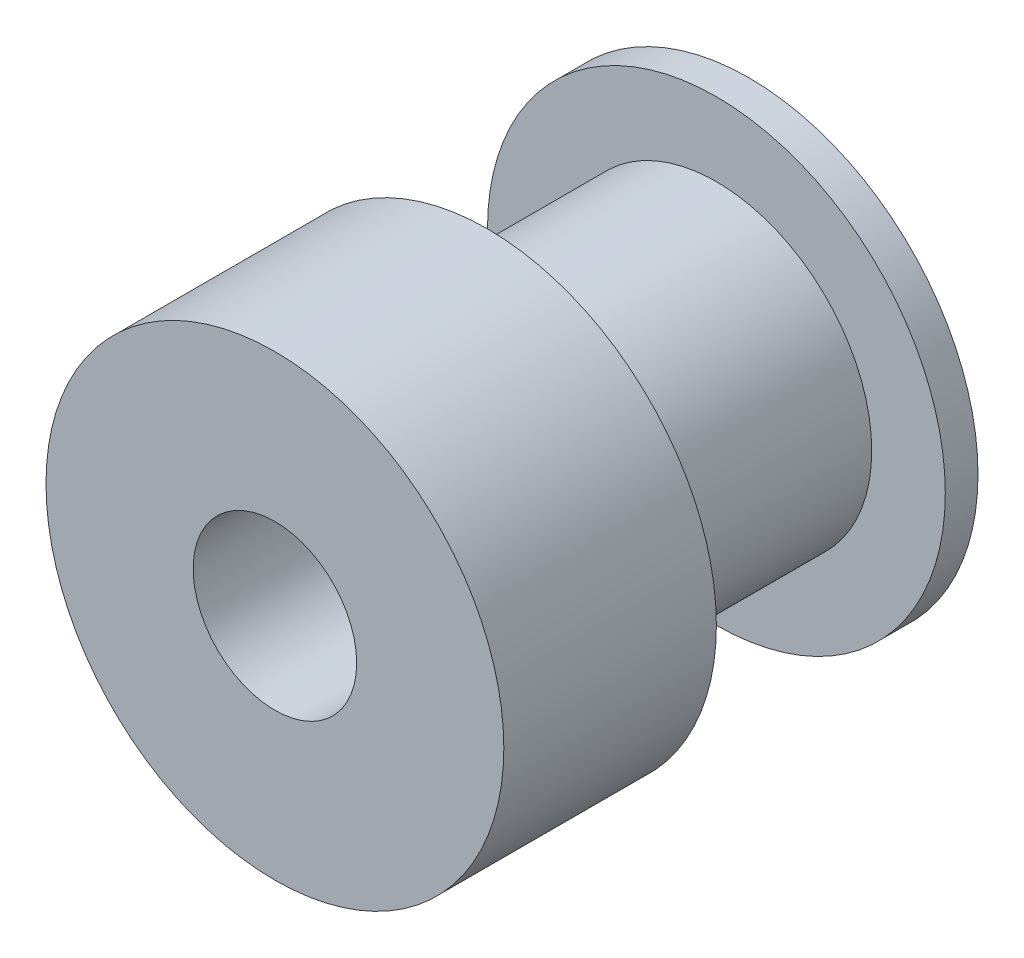
ISO-10303-21;
HEADER;
FILE_DESCRIPTION(('STEP AP214'),'2;1');
FILE_NAME('part.step','',(''),(''),'','','');
FILE_SCHEMA(('AUTOMOTIVE_DESIGN { 1 0 10303 214 1 1 1 1 }'));
ENDSEC;
DATA;
#1=APPLICATION_CONTEXT('core data for automotive mechanical design processes');
#2=APPLICATION_PROTOCOL_DEFINITION('international standard','automotive_design',2000,#1);
#3=PRODUCT_CONTEXT('',#1,'mechanical');
#4=PRODUCT('Part','Part','',(#3));
#5=PRODUCT_RELATED_PRODUCT_CATEGORY('part','',(#4));
#6=PRODUCT_DEFINITION_FORMATION('','',#4);
#7=PRODUCT_DEFINITION_CONTEXT('part definition',#1,'design');
#8=PRODUCT_DEFINITION('design','',#6,#7);
#9=PRODUCT_DEFINITION_SHAPE('','',#8);
#10=(LENGTH_UNIT() NAMED_UNIT(*) SI_UNIT(.MILLI.,.METRE.));
#11=(NAMED_UNIT(*) PLANE_ANGLE_UNIT() SI_UNIT($,.RADIAN.));
#12=(NAMED_UNIT(*) SI_UNIT($,.STERADIAN.) SOLID_ANGLE_UNIT());
#13=UNCERTAINTY_MEASURE_WITH_UNIT(LENGTH_MEASURE(1.E-05),#10,'distance_accuracy_value','');
#14=(GEOMETRIC_REPRESENTATION_CONTEXT(3) GLOBAL_UNCERTAINTY_ASSIGNED_CONTEXT((#13)) GLOBAL_UNIT_ASSIGNED_CONTEXT((#10,
#11,#12)) REPRESENTATION_CONTEXT('',''));
#15=CARTESIAN_POINT('',(0.,0.,0.));
#16=DIRECTION('',(0.,0.,1.));
#17=DIRECTION('',(1.,0.,0.));
#18=AXIS2_PLACEMENT_3D('',#15,#16,#17);
#19=CARTESIAN_POINT('',(0.,0.,1.));
#20=DIRECTION('',(0.,0.,-1.));
#21=DIRECTION('',(-1.,0.,0.));
#22=AXIS2_PLACEMENT_3D('',#19,#20,#21);
#23=CYLINDRICAL_SURFACE('',#22,7.);
#24=CARTESIAN_POINT('',(0.,0.,1.));
#25=DIRECTION('',(0.,0.,1.));
#26=DIRECTION('',(1.,0.,0.));
#27=AXIS2_PLACEMENT_3D('',#24,#25,#26);
#28=CIRCLE('',#27,7.);
#29=CARTESIAN_POINT('',(7.,0.,1.));
#30=VERTEX_POINT('',#29);
#31=EDGE_CURVE('E38',#30,#30,#28,.T.);
#32=ORIENTED_EDGE('',*,*,#31,.F.);
#33=EDGE_LOOP('',(#32));
#34=FACE_BOUND('',#33,.T.);
#35=CARTESIAN_POINT('',(0.,0.,0.));
#36=DIRECTION('',(0.,0.,1.));
#37=DIRECTION('',(1.,0.,0.));
#38=AXIS2_PLACEMENT_3D('',#35,#36,#37);
#39=CIRCLE('',#38,7.);
#40=CARTESIAN_POINT('',(7.,0.,0.));
#41=VERTEX_POINT('',#40);
#42=EDGE_CURVE('E34',#41,#41,#39,.T.);
#43=ORIENTED_EDGE('',*,*,#42,.T.);
#44=EDGE_LOOP('',(#43));
#45=FACE_BOUND('',#44,.T.);
#46=ADVANCED_FACE('F31',(#34,#45),#23,.T.);
#47=CARTESIAN_POINT('',(0.,0.,1.));
#48=DIRECTION('',(0.,0.,1.));
#49=DIRECTION('',(1.,0.,0.));
#50=AXIS2_PLACEMENT_3D('',#47,#48,#49);
#51=PLANE('',#50);
#52=CARTESIAN_POINT('',(0.,0.,1.));
#53=DIRECTION('',(0.,0.,1.));
#54=DIRECTION('',(1.,0.,0.));
#55=AXIS2_PLACEMENT_3D('',#52,#53,#54);
#56=CIRCLE('',#55,4.75);
#57=CARTESIAN_POINT('',(4.75,0.,1.));
#58=VERTEX_POINT('',#57);
#59=EDGE_CURVE('E10',#58,#58,#56,.T.);
#60=ORIENTED_EDGE('',*,*,#59,.F.);
#61=EDGE_LOOP('',(#60));
#62=FACE_BOUND('',#61,.T.);
#63=ORIENTED_EDGE('',*,*,#31,.T.);
#64=EDGE_LOOP('',(#63));
#65=FACE_BOUND('',#64,.T.);
#66=ADVANCED_FACE('F85',(#62,#65),#51,.T.);
#67=CARTESIAN_POINT('',(0.,0.,0.));
#68=DIRECTION('',(0.,0.,1.));
#69=DIRECTION('',(1.,0.,0.));
#70=AXIS2_PLACEMENT_3D('',#67,#68,#69);
#71=PLANE('',#70);
#72=CARTESIAN_POINT('',(0.,0.,0.));
#73=DIRECTION('',(0.,0.,1.));
#74=DIRECTION('',(1.,0.,0.));
#75=AXIS2_PLACEMENT_3D('',#72,#73,#74);
#76=CIRCLE('',#75,2.5);
#77=CARTESIAN_POINT('',(2.5,0.,0.));
#78=VERTEX_POINT('',#77);
#79=EDGE_CURVE('E51',#78,#78,#76,.T.);
#80=ORIENTED_EDGE('',*,*,#79,.T.);
#81=EDGE_LOOP('',(#80));
#82=FACE_BOUND('',#81,.T.);
#83=ORIENTED_EDGE('',*,*,#42,.F.);
#84=EDGE_LOOP('',(#83));
#85=FACE_BOUND('',#84,.T.);
#86=ADVANCED_FACE('F90',(#82,#85),#71,.F.);
#87=CARTESIAN_POINT('',(0.,0.,8.));
#88=DIRECTION('',(0.,0.,-1.));
#89=DIRECTION('',(-1.,0.,0.));
#90=AXIS2_PLACEMENT_3D('',#87,#88,#89);
#91=CYLINDRICAL_SURFACE('',#90,4.75);
#92=CARTESIAN_POINT('',(0.,0.,8.));
#93=DIRECTION('',(0.,0.,1.));
#94=DIRECTION('',(1.,0.,0.));
#95=AXIS2_PLACEMENT_3D('',#92,#93,#94);
#96=CIRCLE('',#95,4.75);
#97=CARTESIAN_POINT('',(4.75,0.,8.));
#98=VERTEX_POINT('',#97);
#99=EDGE_CURVE('E44',#98,#98,#96,.T.);
#100=ORIENTED_EDGE('',*,*,#99,.F.);
#101=EDGE_LOOP('',(#100));
#102=FACE_BOUND('',#101,.T.);
#103=ORIENTED_EDGE('',*,*,#59,.T.);
#104=EDGE_LOOP('',(#103));
#105=FACE_BOUND('',#104,.T.);
#106=ADVANCED_FACE('F73',(#102,#105),#91,.T.);
#107=CARTESIAN_POINT('',(0.,0.,14.5));
#108=DIRECTION('',(0.,0.,-1.));
#109=DIRECTION('',(-1.,0.,0.));
#110=AXIS2_PLACEMENT_3D('',#107,#108,#109);
#111=CYLINDRICAL_SURFACE('',#110,7.);
#112=CARTESIAN_POINT('',(0.,0.,14.5));
#113=DIRECTION('',(0.,0.,1.));
#114=DIRECTION('',(1.,0.,0.));
#115=AXIS2_PLACEMENT_3D('',#112,#113,#114);
#116=CIRCLE('',#115,7.);
#117=CARTESIAN_POINT('',(-7.,0.,14.5));
#118=VERTEX_POINT('',#117);
#119=EDGE_CURVE('E47',#118,#118,#116,.T.);
#120=CARTESIAN_POINT('',(0.,0.,8.));
#121=DIRECTION('',(0.,0.,1.));
#122=DIRECTION('',(1.,0.,0.));
#123=AXIS2_PLACEMENT_3D('',#120,#121,#122);
#124=CIRCLE('',#123,7.);
#125=CARTESIAN_POINT('',(-7.,0.,8.));
#126=VERTEX_POINT('',#125);
#127=EDGE_CURVE('E48',#126,#126,#124,.T.);
#128=CARTESIAN_POINT('',(-7.,0.,14.5));
#129=CARTESIAN_POINT('',(-7.,0.,14.4322916666667));
#130=CARTESIAN_POINT('',(-7.,0.,14.3645833333333));
#131=CARTESIAN_POINT('',(-7.,0.,14.2291666666667));
#132=CARTESIAN_POINT('',(-7.,0.,14.1614583333333));
#133=CARTESIAN_POINT('',(-7.,0.,14.0260416666667));
#134=CARTESIAN_POINT('',(-7.,0.,13.9583333333333));
#135=CARTESIAN_POINT('',(-7.,0.,13.8229166666667));
#136=CARTESIAN_POINT('',(-7.,0.,13.7552083333333));
#137=CARTESIAN_POINT('',(-7.,0.,13.6197916666667));
#138=CARTESIAN_POINT('',(-7.,0.,13.5520833333333));
#139=CARTESIAN_POINT('',(-7.,0.,13.4166666666667));
#140=CARTESIAN_POINT('',(-7.,0.,13.3489583333333));
#141=CARTESIAN_POINT('',(-7.,0.,13.2135416666667));
#142=CARTESIAN_POINT('',(-7.,0.,13.1458333333333));
#143=CARTESIAN_POINT('',(-7.,0.,13.0104166666667));
#144=CARTESIAN_POINT('',(-7.,0.,12.9427083333333));
#145=CARTESIAN_POINT('',(-7.,0.,12.8072916666667));
#146=CARTESIAN_POINT('',(-7.,0.,12.7395833333333));
#147=CARTESIAN_POINT('',(-7.,0.,12.6041666666667));
#148=CARTESIAN_POINT('',(-7.,0.,12.5364583333333));
#149=CARTESIAN_POINT('',(-7.,0.,12.4010416666667));
#150=CARTESIAN_POINT('',(-7.,0.,12.3333333333333));
#151=CARTESIAN_POINT('',(-7.,0.,12.1979166666667));
#152=CARTESIAN_POINT('',(-7.,0.,12.1302083333333));
#153=CARTESIAN_POINT('',(-7.,0.,11.9947916666667));
#154=CARTESIAN_POINT('',(-7.,0.,11.9270833333333));
#155=CARTESIAN_POINT('',(-7.,0.,11.7916666666667));
#156=CARTESIAN_POINT('',(-7.,0.,11.7239583333333));
#157=CARTESIAN_POINT('',(-7.,0.,11.5885416666667));
#158=CARTESIAN_POINT('',(-7.,0.,11.5208333333333));
#159=CARTESIAN_POINT('',(-7.,0.,11.3854166666667));
#160=CARTESIAN_POINT('',(-7.,0.,11.3177083333333));
#161=CARTESIAN_POINT('',(-7.,0.,11.1822916666667));
#162=CARTESIAN_POINT('',(-7.,0.,11.1145833333333));
#163=CARTESIAN_POINT('',(-7.,0.,10.9791666666667));
#164=CARTESIAN_POINT('',(-7.,0.,10.9114583333333));
#165=CARTESIAN_POINT('',(-7.,0.,10.7760416666667));
#166=CARTESIAN_POINT('',(-7.,0.,10.7083333333333));
#167=CARTESIAN_POINT('',(-7.,0.,10.5729166666667));
#168=CARTESIAN_POINT('',(-7.,0.,10.5052083333333));
#169=CARTESIAN_POINT('',(-7.,0.,10.3697916666667));
#170=CARTESIAN_POINT('',(-7.,0.,10.3020833333333));
#171=CARTESIAN_POINT('',(-7.,0.,10.1666666666667));
#172=CARTESIAN_POINT('',(-7.,0.,10.0989583333333));
#173=CARTESIAN_POINT('',(-7.,0.,9.96354166666667));
#174=CARTESIAN_POINT('',(-7.,0.,9.89583333333333));
#175=CARTESIAN_POINT('',(-7.,0.,9.76041666666667));
#176=CARTESIAN_POINT('',(-7.,0.,9.69270833333333));
#177=CARTESIAN_POINT('',(-7.,0.,9.55729166666667));
#178=CARTESIAN_POINT('',(-7.,0.,9.48958333333333));
#179=CARTESIAN_POINT('',(-7.,0.,9.35416666666667));
#180=CARTESIAN_POINT('',(-7.,0.,9.28645833333333));
#181=CARTESIAN_POINT('',(-7.,0.,9.15104166666667));
#182=CARTESIAN_POINT('',(-7.,0.,9.08333333333333));
#183=CARTESIAN_POINT('',(-7.,0.,8.94791666666667));
#184=CARTESIAN_POINT('',(-7.,0.,8.88020833333333));
#185=CARTESIAN_POINT('',(-7.,0.,8.74479166666667));
#186=CARTESIAN_POINT('',(-7.,0.,8.67708333333333));
#187=CARTESIAN_POINT('',(-7.,0.,8.54166666666667));
#188=CARTESIAN_POINT('',(-7.,0.,8.47395833333333));
#189=CARTESIAN_POINT('',(-7.,0.,8.33854166666667));
#190=CARTESIAN_POINT('',(-7.,0.,8.27083333333333));
#191=CARTESIAN_POINT('',(-7.,0.,8.13541666666667));
#192=CARTESIAN_POINT('',(-7.,0.,8.06770833333333));
#193=CARTESIAN_POINT('',(-7.,0.,8.));
#194=B_SPLINE_CURVE_WITH_KNOTS('',3,(#128,#129,#130,#131,#132,#133,#134,#135,#136,#137,#138,
#139,#140,#141,#142,#143,#144,#145,#146,#147,#148,#149,#150,#151,#152,#153,#154,#155,#156,#157,
#158,#159,#160,#161,#162,#163,#164,#165,#166,#167,#168,#169,#170,#171,#172,#173,#174,#175,#176,
#177,#178,#179,#180,#181,#182,#183,#184,#185,#186,#187,#188,#189,#190,#191,#192,#193),
.UNSPECIFIED.,.F.,.F.,(4,2,2,2,2,2,2,2,2,2,2,2,2,2,2,2,2,2,2,2,2,2,2,2,2,2,2,2,2,2,2,2,4),(0.,
0.203124999999998,0.406249999999999,0.609374999999999,0.812499999999999,1.015625,1.21875,
1.421875,1.625,1.828125,2.03125,2.234375,2.4375,2.640625,2.84375,3.046875,3.25,3.453125,3.65625,
3.859375,4.0625,4.265625,4.46875,4.671875,4.875,5.078125,5.28125,5.484375,5.6875,5.890625,
6.09375,6.296875,6.5),.UNSPECIFIED.);
#195=EDGE_CURVE('BSEAM67',#118,#126,#194,.T.);
#196=ORIENTED_EDGE('',*,*,#119,.F.);
#197=ORIENTED_EDGE('',*,*,#127,.T.);
#198=ORIENTED_EDGE('',*,*,#195,.T.);
#199=ORIENTED_EDGE('',*,*,#195,.F.);
#200=EDGE_LOOP('',(#196,#198,#197,#199));
#201=FACE_BOUND('',#200,.T.);
#202=ADVANCED_FACE('F67',(#201),#111,.T.);
#203=CARTESIAN_POINT('',(0.,0.,14.5));
#204=DIRECTION('',(0.,0.,1.));
#205=DIRECTION('',(1.,0.,0.));
#206=AXIS2_PLACEMENT_3D('',#203,#204,#205);
#207=PLANE('',#206);
#208=CARTESIAN_POINT('',(0.,0.,14.5));
#209=DIRECTION('',(0.,0.,1.));
#210=DIRECTION('',(1.,0.,0.));
#211=AXIS2_PLACEMENT_3D('',#208,#209,#210);
#212=CIRCLE('',#211,2.5);
#213=CARTESIAN_POINT('',(2.5,0.,14.5));
#214=VERTEX_POINT('',#213);
#215=EDGE_CURVE('E56',#214,#214,#212,.T.);
#216=ORIENTED_EDGE('',*,*,#215,.F.);
#217=EDGE_LOOP('',(#216));
#218=FACE_BOUND('',#217,.T.);
#219=ORIENTED_EDGE('',*,*,#119,.T.);
#220=EDGE_LOOP('',(#219));
#221=FACE_BOUND('',#220,.T.);
#222=ADVANCED_FACE('F63',(#218,#221),#207,.T.);
#223=CARTESIAN_POINT('',(0.,0.,8.));
#224=DIRECTION('',(0.,0.,1.));
#225=DIRECTION('',(1.,0.,0.));
#226=AXIS2_PLACEMENT_3D('',#223,#224,#225);
#227=PLANE('',#226);
#228=ORIENTED_EDGE('',*,*,#99,.T.);
#229=EDGE_LOOP('',(#228));
#230=FACE_BOUND('',#229,.T.);
#231=ORIENTED_EDGE('',*,*,#127,.F.);
#232=EDGE_LOOP('',(#231));
#233=FACE_BOUND('',#232,.T.);
#234=ADVANCED_FACE('F66',(#230,#233),#227,.F.);
#235=CARTESIAN_POINT('',(0.,0.,-1.5));
#236=DIRECTION('',(0.,0.,1.));
#237=DIRECTION('',(1.,0.,0.));
#238=AXIS2_PLACEMENT_3D('',#235,#236,#237);
#239=CYLINDRICAL_SURFACE('',#238,2.5);
#240=ORIENTED_EDGE('',*,*,#215,.T.);
#241=EDGE_LOOP('',(#240));
#242=FACE_BOUND('',#241,.T.);
#243=ORIENTED_EDGE('',*,*,#79,.F.);
#244=EDGE_LOOP('',(#243));
#245=FACE_BOUND('',#244,.T.);
#246=ADVANCED_FACE('F60',(#242,#245),#239,.F.);
#247=CLOSED_SHELL('',(#46,#66,#86,#106,#202,#222,#234,#246));
#248=MANIFOLD_SOLID_BREP('B2',#247);
#249=ADVANCED_BREP_SHAPE_REPRESENTATION('',(#18,#248),#14);
#250=SHAPE_DEFINITION_REPRESENTATION(#9,#249);
ENDSEC;
END-ISO-10303-21;
